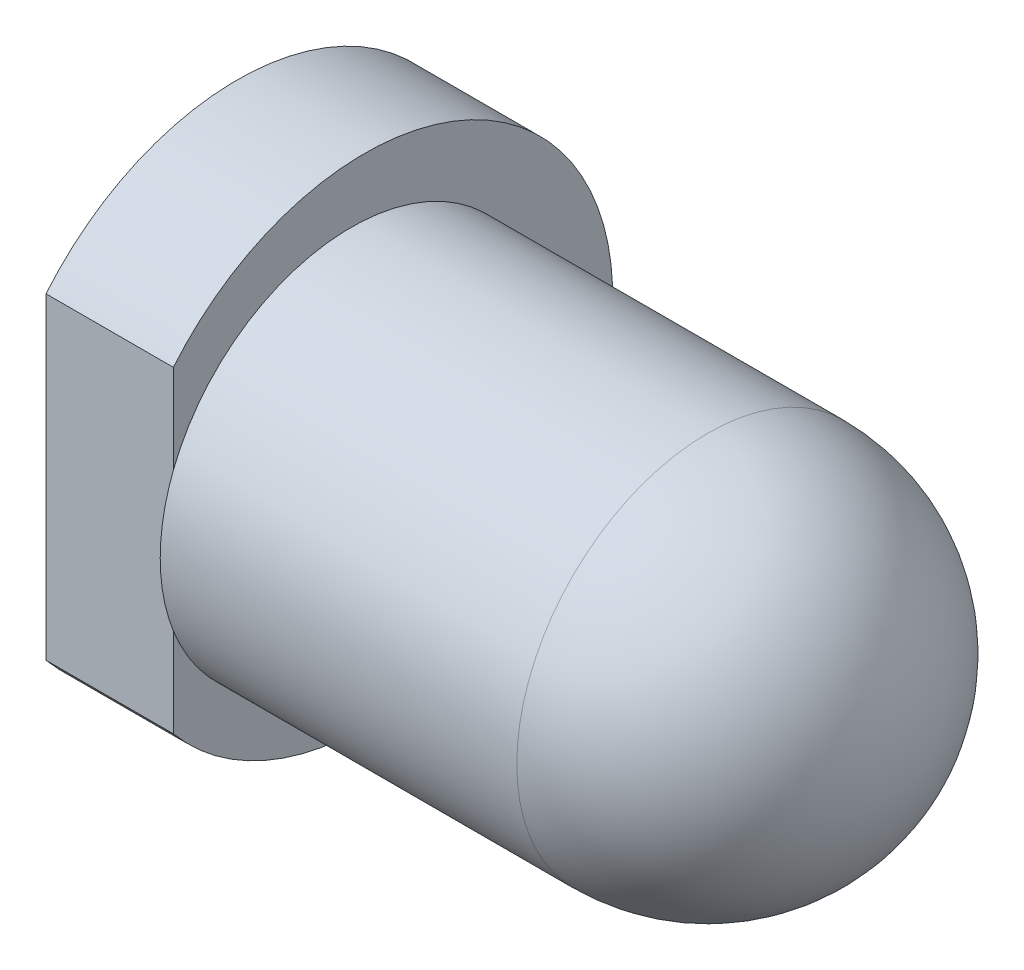
ISO-10303-21;
HEADER;
FILE_DESCRIPTION(('STEP AP214'),'2;1');
FILE_NAME('part.step','',(''),(''),'','','');
FILE_SCHEMA(('AUTOMOTIVE_DESIGN { 1 0 10303 214 1 1 1 1 }'));
ENDSEC;
DATA;
#1=APPLICATION_CONTEXT('core data for automotive mechanical design processes');
#2=APPLICATION_PROTOCOL_DEFINITION('international standard','automotive_design',2000,#1);
#3=PRODUCT_CONTEXT('',#1,'mechanical');
#4=PRODUCT('Part','Part','',(#3));
#5=PRODUCT_RELATED_PRODUCT_CATEGORY('part','',(#4));
#6=PRODUCT_DEFINITION_FORMATION('','',#4);
#7=PRODUCT_DEFINITION_CONTEXT('part definition',#1,'design');
#8=PRODUCT_DEFINITION('design','',#6,#7);
#9=PRODUCT_DEFINITION_SHAPE('','',#8);
#10=(LENGTH_UNIT() NAMED_UNIT(*) SI_UNIT(.MILLI.,.METRE.));
#11=(NAMED_UNIT(*) PLANE_ANGLE_UNIT() SI_UNIT($,.RADIAN.));
#12=(NAMED_UNIT(*) SI_UNIT($,.STERADIAN.) SOLID_ANGLE_UNIT());
#13=UNCERTAINTY_MEASURE_WITH_UNIT(LENGTH_MEASURE(1.E-05),#10,'distance_accuracy_value','');
#14=(GEOMETRIC_REPRESENTATION_CONTEXT(3) GLOBAL_UNCERTAINTY_ASSIGNED_CONTEXT((#13)) GLOBAL_UNIT_ASSIGNED_CONTEXT((#10,
#11,#12)) REPRESENTATION_CONTEXT('',''));
#15=CARTESIAN_POINT('',(0.,0.,0.));
#16=DIRECTION('',(0.,0.,1.));
#17=DIRECTION('',(1.,0.,0.));
#18=AXIS2_PLACEMENT_3D('',#15,#16,#17);
#19=CARTESIAN_POINT('',(1.,0.,0.));
#20=DIRECTION('',(-1.,0.,0.));
#21=DIRECTION('',(0.,0.,1.));
#22=AXIS2_PLACEMENT_3D('',#19,#20,#21);
#23=CYLINDRICAL_SURFACE('',#22,1.95);
#24=DIRECTION('',(-1.,0.,0.));
#25=VECTOR('',#24,1.);
#26=CARTESIAN_POINT('',(1.,1.24599357943771,1.5));
#27=LINE('',#26,#25);
#28=CARTESIAN_POINT('',(1.,1.24599357943771,1.5));
#29=VERTEX_POINT('',#28);
#30=CARTESIAN_POINT('',(0.,1.24599357943771,1.5));
#31=VERTEX_POINT('',#30);
#32=EDGE_CURVE('E69',#29,#31,#27,.T.);
#33=ORIENTED_EDGE('',*,*,#32,.F.);
#34=CARTESIAN_POINT('',(1.,0.,0.));
#35=DIRECTION('',(1.,0.,0.));
#36=DIRECTION('',(0.,0.,-1.));
#37=AXIS2_PLACEMENT_3D('',#34,#35,#36);
#38=CIRCLE('',#37,1.95);
#39=CARTESIAN_POINT('',(1.,-1.24599357943771,1.5));
#40=VERTEX_POINT('',#39);
#41=EDGE_CURVE('E80',#40,#29,#38,.T.);
#42=ORIENTED_EDGE('',*,*,#41,.F.);
#43=DIRECTION('',(-1.,0.,0.));
#44=VECTOR('',#43,1.);
#45=CARTESIAN_POINT('',(1.,-1.24599357943771,1.5));
#46=LINE('',#45,#44);
#47=CARTESIAN_POINT('',(0.,-1.24599357943771,1.5));
#48=VERTEX_POINT('',#47);
#49=EDGE_CURVE('E74',#48,#40,#46,.F.);
#50=ORIENTED_EDGE('',*,*,#49,.F.);
#51=CARTESIAN_POINT('',(0.,0.,0.));
#52=DIRECTION('',(1.,0.,0.));
#53=DIRECTION('',(0.,0.,-1.));
#54=AXIS2_PLACEMENT_3D('',#51,#52,#53);
#55=CIRCLE('',#54,1.95);
#56=EDGE_CURVE('E82',#48,#31,#55,.T.);
#57=ORIENTED_EDGE('',*,*,#56,.T.);
#58=EDGE_LOOP('',(#33,#42,#50,#57));
#59=FACE_BOUND('',#58,.T.);
#60=ADVANCED_FACE('F35',(#59),#23,.T.);
#61=CARTESIAN_POINT('',(1.,0.,0.));
#62=DIRECTION('',(1.,0.,0.));
#63=DIRECTION('',(0.,0.,-1.));
#64=AXIS2_PLACEMENT_3D('',#61,#62,#63);
#65=PLANE('',#64);
#66=ORIENTED_EDGE('',*,*,#41,.T.);
#67=DIRECTION('',(0.,-1.,0.));
#68=VECTOR('',#67,1.);
#69=CARTESIAN_POINT('',(1.,0.,1.5));
#70=LINE('',#69,#68);
#71=CARTESIAN_POINT('',(1.,0.546571822537754,1.5));
#72=VERTEX_POINT('',#71);
#73=EDGE_CURVE('E66',#29,#72,#70,.T.);
#74=ORIENTED_EDGE('',*,*,#73,.T.);
#75=CARTESIAN_POINT('',(1.,0.,0.103125187138176));
#76=DIRECTION('',(1.,0.,0.));
#77=DIRECTION('',(0.,0.,-1.));
#78=AXIS2_PLACEMENT_3D('',#75,#76,#77);
#79=CIRCLE('',#78,1.5);
#80=CARTESIAN_POINT('',(1.,-0.546571822537754,1.5));
#81=VERTEX_POINT('',#80);
#82=EDGE_CURVE('E86',#81,#72,#79,.T.);
#83=ORIENTED_EDGE('',*,*,#82,.F.);
#84=EDGE_CURVE('E76',#81,#40,#70,.T.);
#85=ORIENTED_EDGE('',*,*,#84,.T.);
#86=EDGE_LOOP('',(#66,#74,#83,#85));
#87=FACE_BOUND('',#86,.T.);
#88=ADVANCED_FACE('F85',(#87),#65,.T.);
#89=CARTESIAN_POINT('',(0.,0.,0.));
#90=DIRECTION('',(1.,0.,0.));
#91=DIRECTION('',(0.,0.,-1.));
#92=AXIS2_PLACEMENT_3D('',#89,#90,#91);
#93=PLANE('',#92);
#94=DIRECTION('',(0.,-1.,0.));
#95=VECTOR('',#94,1.);
#96=CARTESIAN_POINT('',(0.,0.,1.5));
#97=LINE('',#96,#95);
#98=EDGE_CURVE('E11',#31,#48,#97,.T.);
#99=ORIENTED_EDGE('',*,*,#98,.F.);
#100=ORIENTED_EDGE('',*,*,#56,.F.);
#101=EDGE_LOOP('',(#99,#100));
#102=FACE_BOUND('',#101,.T.);
#103=ADVANCED_FACE('F109',(#102),#93,.F.);
#104=CARTESIAN_POINT('',(5.3,0.,0.103125187138176));
#105=DIRECTION('',(-1.,0.,0.));
#106=DIRECTION('',(0.,0.,1.));
#107=AXIS2_PLACEMENT_3D('',#104,#105,#106);
#108=CYLINDRICAL_SURFACE('',#107,1.5);
#109=CARTESIAN_POINT('',(3.8,0.,0.103125187138176));
#110=DIRECTION('',(-1.,0.,0.));
#111=DIRECTION('',(0.,0.,1.));
#112=AXIS2_PLACEMENT_3D('',#109,#110,#111);
#113=CIRCLE('',#112,1.5);
#114=CARTESIAN_POINT('',(3.8,0.,1.60312518713818));
#115=VERTEX_POINT('',#114);
#116=EDGE_CURVE('E43',#115,#115,#113,.T.);
#117=ORIENTED_EDGE('',*,*,#116,.T.);
#118=EDGE_LOOP('',(#117));
#119=FACE_BOUND('',#118,.T.);
#120=EDGE_CURVE('E88',#72,#81,#79,.T.);
#121=ORIENTED_EDGE('',*,*,#120,.T.);
#122=ORIENTED_EDGE('',*,*,#82,.T.);
#123=EDGE_LOOP('',(#121,#122));
#124=FACE_BOUND('',#123,.T.);
#125=ADVANCED_FACE('F96',(#119,#124),#108,.T.);
#126=CARTESIAN_POINT('',(3.8,0.,0.103125187138176));
#127=DIRECTION('',(1.,0.,0.));
#128=DIRECTION('',(0.,0.,-1.));
#129=AXIS2_PLACEMENT_3D('',#126,#127,#128);
#130=SPHERICAL_SURFACE('',#129,1.5);
#131=ORIENTED_EDGE('',*,*,#116,.F.);
#132=EDGE_LOOP('',(#131));
#133=FACE_BOUND('',#132,.T.);
#134=ADVANCED_FACE('F37',(#133),#130,.T.);
#135=CARTESIAN_POINT('',(0.,0.,1.5));
#136=DIRECTION('',(0.,0.,1.));
#137=DIRECTION('',(1.,0.,0.));
#138=AXIS2_PLACEMENT_3D('',#135,#136,#137);
#139=PLANE('',#138);
#140=ORIENTED_EDGE('',*,*,#32,.T.);
#141=ORIENTED_EDGE('',*,*,#98,.T.);
#142=ORIENTED_EDGE('',*,*,#49,.T.);
#143=ORIENTED_EDGE('',*,*,#84,.F.);
#144=EDGE_CURVE('E49',#72,#81,#70,.T.);
#145=ORIENTED_EDGE('',*,*,#144,.F.);
#146=ORIENTED_EDGE('',*,*,#73,.F.);
#147=EDGE_LOOP('',(#140,#141,#142,#143,#145,#146));
#148=FACE_BOUND('',#147,.T.);
#149=ADVANCED_FACE('F68',(#148),#139,.T.);
#150=CARTESIAN_POINT('',(1.,0.,1.5));
#151=DIRECTION('',(1.,0.,0.));
#152=DIRECTION('',(0.,0.,-1.));
#153=AXIS2_PLACEMENT_3D('',#150,#151,#152);
#154=PLANE('',#153);
#155=ORIENTED_EDGE('',*,*,#144,.T.);
#156=ORIENTED_EDGE('',*,*,#120,.F.);
#157=EDGE_LOOP('',(#155,#156));
#158=FACE_BOUND('',#157,.T.);
#159=ADVANCED_FACE('F97',(#158),#154,.F.);
#160=CLOSED_SHELL('',(#60,#88,#103,#125,#134,#149,#159));
#161=MANIFOLD_SOLID_BREP('B2',#160);
#162=ADVANCED_BREP_SHAPE_REPRESENTATION('',(#18,#161),#14);
#163=SHAPE_DEFINITION_REPRESENTATION(#9,#162);
ENDSEC;
END-ISO-10303-21;
